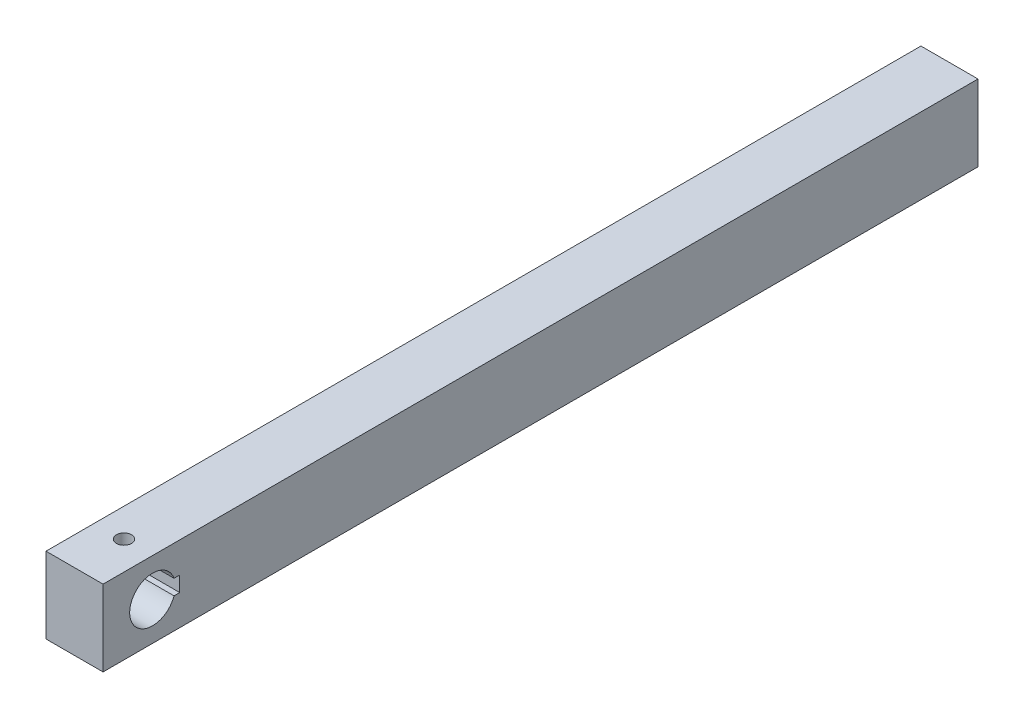
ISO-10303-21;
HEADER;
FILE_DESCRIPTION(('STEP AP214'),'2;1');
FILE_NAME('part.step','',(''),(''),'','','');
FILE_SCHEMA(('AUTOMOTIVE_DESIGN { 1 0 10303 214 1 1 1 1 }'));
ENDSEC;
DATA;
#1=APPLICATION_CONTEXT('core data for automotive mechanical design processes');
#2=APPLICATION_PROTOCOL_DEFINITION('international standard','automotive_design',2000,#1);
#3=PRODUCT_CONTEXT('',#1,'mechanical');
#4=PRODUCT('Part','Part','',(#3));
#5=PRODUCT_RELATED_PRODUCT_CATEGORY('part','',(#4));
#6=PRODUCT_DEFINITION_FORMATION('','',#4);
#7=PRODUCT_DEFINITION_CONTEXT('part definition',#1,'design');
#8=PRODUCT_DEFINITION('design','',#6,#7);
#9=PRODUCT_DEFINITION_SHAPE('','',#8);
#10=(LENGTH_UNIT() NAMED_UNIT(*) SI_UNIT(.MILLI.,.METRE.));
#11=(NAMED_UNIT(*) PLANE_ANGLE_UNIT() SI_UNIT($,.RADIAN.));
#12=(NAMED_UNIT(*) SI_UNIT($,.STERADIAN.) SOLID_ANGLE_UNIT());
#13=UNCERTAINTY_MEASURE_WITH_UNIT(LENGTH_MEASURE(1.E-05),#10,'distance_accuracy_value','');
#14=(GEOMETRIC_REPRESENTATION_CONTEXT(3) GLOBAL_UNCERTAINTY_ASSIGNED_CONTEXT((#13)) GLOBAL_UNIT_ASSIGNED_CONTEXT((#10,
#11,#12)) REPRESENTATION_CONTEXT('',''));
#15=CARTESIAN_POINT('',(0.,0.,0.));
#16=DIRECTION('',(0.,0.,1.));
#17=DIRECTION('',(1.,0.,0.));
#18=AXIS2_PLACEMENT_3D('',#15,#16,#17);
#19=CARTESIAN_POINT('',(7.5,10.,230.));
#20=DIRECTION('',(-1.,0.,0.));
#21=DIRECTION('',(0.,-1.,0.));
#22=AXIS2_PLACEMENT_3D('',#19,#20,#21);
#23=PLANE('',#22);
#24=DIRECTION('',(0.,0.,1.));
#25=VECTOR('',#24,1.);
#26=CARTESIAN_POINT('',(7.5,-2.,230.));
#27=LINE('',#26,#25);
#28=CARTESIAN_POINT('',(7.5,-2.,209.843145750508));
#29=VERTEX_POINT('',#28);
#30=CARTESIAN_POINT('',(7.5,-2.,211.343145750508));
#31=VERTEX_POINT('',#30);
#32=EDGE_CURVE('E139',#29,#31,#27,.T.);
#33=ORIENTED_EDGE('',*,*,#32,.T.);
#34=CARTESIAN_POINT('',(7.5,0.,217.));
#35=DIRECTION('',(-1.,0.,0.));
#36=DIRECTION('',(0.,-1.,0.));
#37=AXIS2_PLACEMENT_3D('',#34,#35,#36);
#38=CIRCLE('',#37,6.00000000000001);
#39=CARTESIAN_POINT('',(7.5,2.,211.343145750508));
#40=VERTEX_POINT('',#39);
#41=EDGE_CURVE('E142',#31,#40,#38,.T.);
#42=ORIENTED_EDGE('',*,*,#41,.T.);
#43=DIRECTION('',(0.,0.,-1.));
#44=VECTOR('',#43,1.);
#45=CARTESIAN_POINT('',(7.5,2.,230.));
#46=LINE('',#45,#44);
#47=CARTESIAN_POINT('',(7.5,2.,209.843145750508));
#48=VERTEX_POINT('',#47);
#49=EDGE_CURVE('E134',#40,#48,#46,.T.);
#50=ORIENTED_EDGE('',*,*,#49,.T.);
#51=DIRECTION('',(0.,-1.,0.));
#52=VECTOR('',#51,1.);
#53=CARTESIAN_POINT('',(7.5,10.,209.843145750508));
#54=LINE('',#53,#52);
#55=EDGE_CURVE('E114',#48,#29,#54,.T.);
#56=ORIENTED_EDGE('',*,*,#55,.T.);
#57=EDGE_LOOP('',(#33,#42,#50,#56));
#58=FACE_BOUND('',#57,.T.);
#59=DIRECTION('',(0.,1.,0.));
#60=VECTOR('',#59,1.);
#61=CARTESIAN_POINT('',(7.5,10.,0.));
#62=LINE('',#61,#60);
#63=CARTESIAN_POINT('',(7.5,-10.,0.));
#64=VERTEX_POINT('',#63);
#65=CARTESIAN_POINT('',(7.5,10.,0.));
#66=VERTEX_POINT('',#65);
#67=EDGE_CURVE('E145',#64,#66,#62,.T.);
#68=ORIENTED_EDGE('',*,*,#67,.T.);
#69=DIRECTION('',(0.,0.,-1.));
#70=VECTOR('',#69,1.);
#71=CARTESIAN_POINT('',(7.5,10.,230.));
#72=LINE('',#71,#70);
#73=CARTESIAN_POINT('',(7.5,10.,230.));
#74=VERTEX_POINT('',#73);
#75=EDGE_CURVE('E11',#74,#66,#72,.T.);
#76=ORIENTED_EDGE('',*,*,#75,.F.);
#77=DIRECTION('',(0.,1.,0.));
#78=VECTOR('',#77,1.);
#79=CARTESIAN_POINT('',(7.5,10.,230.));
#80=LINE('',#79,#78);
#81=CARTESIAN_POINT('',(7.5,-10.,230.));
#82=VERTEX_POINT('',#81);
#83=EDGE_CURVE('E146',#82,#74,#80,.T.);
#84=ORIENTED_EDGE('',*,*,#83,.F.);
#85=DIRECTION('',(0.,0.,-1.));
#86=VECTOR('',#85,1.);
#87=CARTESIAN_POINT('',(7.5,-10.,230.));
#88=LINE('',#87,#86);
#89=EDGE_CURVE('E156',#82,#64,#88,.T.);
#90=ORIENTED_EDGE('',*,*,#89,.T.);
#91=EDGE_LOOP('',(#68,#76,#84,#90));
#92=FACE_BOUND('',#91,.T.);
#93=ADVANCED_FACE('F38',(#58,#92),#23,.F.);
#94=CARTESIAN_POINT('',(-7.5,10.,230.));
#95=DIRECTION('',(0.,-1.,0.));
#96=DIRECTION('',(0.,0.,-1.));
#97=AXIS2_PLACEMENT_3D('',#94,#95,#96);
#98=PLANE('',#97);
#99=CARTESIAN_POINT('',(0.,10.,217.));
#100=DIRECTION('',(0.,1.,0.));
#101=DIRECTION('',(0.,0.,1.));
#102=AXIS2_PLACEMENT_3D('',#99,#100,#101);
#103=CIRCLE('',#102,1.984375);
#104=CARTESIAN_POINT('',(0.,10.,218.984375));
#105=VERTEX_POINT('',#104);
#106=EDGE_CURVE('E224',#105,#105,#103,.T.);
#107=ORIENTED_EDGE('',*,*,#106,.F.);
#108=EDGE_LOOP('',(#107));
#109=FACE_BOUND('',#108,.T.);
#110=DIRECTION('',(-1.,0.,0.));
#111=VECTOR('',#110,1.);
#112=CARTESIAN_POINT('',(-7.5,10.,0.));
#113=LINE('',#112,#111);
#114=CARTESIAN_POINT('',(-7.5,10.,0.));
#115=VERTEX_POINT('',#114);
#116=EDGE_CURVE('E159',#66,#115,#113,.T.);
#117=ORIENTED_EDGE('',*,*,#116,.T.);
#118=DIRECTION('',(0.,0.,-1.));
#119=VECTOR('',#118,1.);
#120=CARTESIAN_POINT('',(-7.5,10.,230.));
#121=LINE('',#120,#119);
#122=CARTESIAN_POINT('',(-7.5,10.,230.));
#123=VERTEX_POINT('',#122);
#124=EDGE_CURVE('E51',#123,#115,#121,.T.);
#125=ORIENTED_EDGE('',*,*,#124,.F.);
#126=DIRECTION('',(-1.,0.,0.));
#127=VECTOR('',#126,1.);
#128=CARTESIAN_POINT('',(-7.5,10.,230.));
#129=LINE('',#128,#127);
#130=EDGE_CURVE('E149',#74,#123,#129,.T.);
#131=ORIENTED_EDGE('',*,*,#130,.F.);
#132=ORIENTED_EDGE('',*,*,#75,.T.);
#133=EDGE_LOOP('',(#117,#125,#131,#132));
#134=FACE_BOUND('',#133,.T.);
#135=ADVANCED_FACE('F188',(#109,#134),#98,.F.);
#136=CARTESIAN_POINT('',(-7.5,10.,230.));
#137=DIRECTION('',(1.,0.,0.));
#138=DIRECTION('',(0.,1.,0.));
#139=AXIS2_PLACEMENT_3D('',#136,#137,#138);
#140=PLANE('',#139);
#141=DIRECTION('',(0.,0.,-1.));
#142=VECTOR('',#141,1.);
#143=CARTESIAN_POINT('',(-7.5,2.,209.843145750508));
#144=LINE('',#143,#142);
#145=CARTESIAN_POINT('',(-7.5,1.99999999999999,211.343145750508));
#146=VERTEX_POINT('',#145);
#147=CARTESIAN_POINT('',(-7.5,2.,209.843145750508));
#148=VERTEX_POINT('',#147);
#149=EDGE_CURVE('E120',#146,#148,#144,.T.);
#150=ORIENTED_EDGE('',*,*,#149,.F.);
#151=CARTESIAN_POINT('',(-7.5,0.,217.));
#152=DIRECTION('',(-1.,0.,0.));
#153=DIRECTION('',(0.,-1.,0.));
#154=AXIS2_PLACEMENT_3D('',#151,#152,#153);
#155=CIRCLE('',#154,6.00000000000001);
#156=CARTESIAN_POINT('',(-7.5,-2.,211.343145750508));
#157=VERTEX_POINT('',#156);
#158=EDGE_CURVE('E66',#157,#146,#155,.T.);
#159=ORIENTED_EDGE('',*,*,#158,.F.);
#160=DIRECTION('',(0.,0.,1.));
#161=VECTOR('',#160,1.);
#162=CARTESIAN_POINT('',(-7.5,-2.,209.843145750508));
#163=LINE('',#162,#161);
#164=CARTESIAN_POINT('',(-7.5,-2.,209.843145750508));
#165=VERTEX_POINT('',#164);
#166=EDGE_CURVE('E127',#165,#157,#163,.T.);
#167=ORIENTED_EDGE('',*,*,#166,.F.);
#168=DIRECTION('',(0.,-1.,0.));
#169=VECTOR('',#168,1.);
#170=CARTESIAN_POINT('',(-7.5,2.,209.843145750508));
#171=LINE('',#170,#169);
#172=EDGE_CURVE('E111',#148,#165,#171,.T.);
#173=ORIENTED_EDGE('',*,*,#172,.F.);
#174=EDGE_LOOP('',(#150,#159,#167,#173));
#175=FACE_BOUND('',#174,.T.);
#176=DIRECTION('',(0.,-1.,0.));
#177=VECTOR('',#176,1.);
#178=CARTESIAN_POINT('',(-7.5,10.,0.));
#179=LINE('',#178,#177);
#180=CARTESIAN_POINT('',(-7.5,-10.,0.));
#181=VERTEX_POINT('',#180);
#182=EDGE_CURVE('E161',#115,#181,#179,.T.);
#183=ORIENTED_EDGE('',*,*,#182,.T.);
#184=DIRECTION('',(0.,0.,-1.));
#185=VECTOR('',#184,1.);
#186=CARTESIAN_POINT('',(-7.5,-10.,230.));
#187=LINE('',#186,#185);
#188=CARTESIAN_POINT('',(-7.5,-10.,230.));
#189=VERTEX_POINT('',#188);
#190=EDGE_CURVE('E166',#189,#181,#187,.T.);
#191=ORIENTED_EDGE('',*,*,#190,.F.);
#192=DIRECTION('',(0.,-1.,0.));
#193=VECTOR('',#192,1.);
#194=CARTESIAN_POINT('',(-7.5,10.,230.));
#195=LINE('',#194,#193);
#196=EDGE_CURVE('E152',#123,#189,#195,.T.);
#197=ORIENTED_EDGE('',*,*,#196,.F.);
#198=ORIENTED_EDGE('',*,*,#124,.T.);
#199=EDGE_LOOP('',(#183,#191,#197,#198));
#200=FACE_BOUND('',#199,.T.);
#201=ADVANCED_FACE('F124',(#175,#200),#140,.F.);
#202=CARTESIAN_POINT('',(-7.5,-10.,230.));
#203=DIRECTION('',(0.,1.,0.));
#204=DIRECTION('',(0.,0.,1.));
#205=AXIS2_PLACEMENT_3D('',#202,#203,#204);
#206=PLANE('',#205);
#207=DIRECTION('',(1.,0.,0.));
#208=VECTOR('',#207,1.);
#209=CARTESIAN_POINT('',(-7.5,-10.,0.));
#210=LINE('',#209,#208);
#211=EDGE_CURVE('E150',#181,#64,#210,.T.);
#212=ORIENTED_EDGE('',*,*,#211,.T.);
#213=ORIENTED_EDGE('',*,*,#89,.F.);
#214=DIRECTION('',(1.,0.,0.));
#215=VECTOR('',#214,1.);
#216=CARTESIAN_POINT('',(-7.5,-10.,230.));
#217=LINE('',#216,#215);
#218=EDGE_CURVE('E154',#189,#82,#217,.T.);
#219=ORIENTED_EDGE('',*,*,#218,.F.);
#220=ORIENTED_EDGE('',*,*,#190,.T.);
#221=EDGE_LOOP('',(#212,#213,#219,#220));
#222=FACE_BOUND('',#221,.T.);
#223=ADVANCED_FACE('F181',(#222),#206,.F.);
#224=CARTESIAN_POINT('',(0.,0.,230.));
#225=DIRECTION('',(0.,0.,1.));
#226=DIRECTION('',(1.,0.,0.));
#227=AXIS2_PLACEMENT_3D('',#224,#225,#226);
#228=PLANE('',#227);
#229=ORIENTED_EDGE('',*,*,#83,.T.);
#230=ORIENTED_EDGE('',*,*,#130,.T.);
#231=ORIENTED_EDGE('',*,*,#196,.T.);
#232=ORIENTED_EDGE('',*,*,#218,.T.);
#233=EDGE_LOOP('',(#229,#230,#231,#232));
#234=FACE_BOUND('',#233,.T.);
#235=ADVANCED_FACE('F187',(#234),#228,.T.);
#236=CARTESIAN_POINT('',(0.,0.,0.));
#237=DIRECTION('',(0.,0.,1.));
#238=DIRECTION('',(1.,0.,0.));
#239=AXIS2_PLACEMENT_3D('',#236,#237,#238);
#240=PLANE('',#239);
#241=ORIENTED_EDGE('',*,*,#67,.F.);
#242=ORIENTED_EDGE('',*,*,#211,.F.);
#243=ORIENTED_EDGE('',*,*,#182,.F.);
#244=ORIENTED_EDGE('',*,*,#116,.F.);
#245=EDGE_LOOP('',(#241,#242,#243,#244));
#246=FACE_BOUND('',#245,.T.);
#247=ADVANCED_FACE('F178',(#246),#240,.F.);
#248=CARTESIAN_POINT('',(37.5,0.,217.));
#249=DIRECTION('',(-1.,0.,0.));
#250=DIRECTION('',(0.,-1.,0.));
#251=AXIS2_PLACEMENT_3D('',#248,#249,#250);
#252=CYLINDRICAL_SURFACE('',#251,6.00000000000001);
#253=CARTESIAN_POINT('',(0.,5.66235426826819,218.984375));
#254=CARTESIAN_POINT('',(0.108138819757154,5.66235406074909,218.984375340178));
#255=CARTESIAN_POINT('',(0.2162759236074,5.66548595879064,218.975505536816));
#256=CARTESIAN_POINT('',(0.429349871968276,5.67761132991367,218.940378002836));
#257=CARTESIAN_POINT('',(0.534286144120666,5.68660584496406,218.914117181281));
#258=CARTESIAN_POINT('',(0.73783780247271,5.70932864073507,218.845228140855));
#259=CARTESIAN_POINT('',(0.836464991957601,5.72304775593342,218.802631594549));
#260=CARTESIAN_POINT('',(1.02520454428127,5.75366069618972,218.70238810627));
#261=CARTESIAN_POINT('',(1.11531506871683,5.77055520434499,218.644737924887));
#262=CARTESIAN_POINT('',(1.28793367286277,5.80634502128158,218.513645498903));
#263=CARTESIAN_POINT('',(1.37006589123694,5.82528962641224,218.439721669057));
#264=CARTESIAN_POINT('',(1.52102305974272,5.86262801346751,218.279208495686));
#265=CARTESIAN_POINT('',(1.58984591014918,5.88102170809265,218.192617157477));
#266=CARTESIAN_POINT('',(1.71393014556128,5.91575568820065,218.006484491273));
#267=CARTESIAN_POINT('',(1.76879857527266,5.93203123304274,217.906668054246));
#268=CARTESIAN_POINT('',(1.86081802137079,5.96011491829826,217.698592027096));
#269=CARTESIAN_POINT('',(1.89797373371851,5.97192424261556,217.590334683675));
#270=CARTESIAN_POINT('',(1.95224094887771,5.98939574657387,217.372390002917));
#271=CARTESIAN_POINT('',(1.96999614323579,5.99525484570673,217.262879021608));
#272=CARTESIAN_POINT('',(1.9870040978909,6.00086429126344,217.04228594645));
#273=CARTESIAN_POINT('',(1.98626155466361,6.00061618827312,216.931204258552));
#274=CARTESIAN_POINT('',(1.9667053354199,5.99417309522021,216.71517582389));
#275=CARTESIAN_POINT('',(1.94859064151666,5.98820813327366,216.610157820136));
#276=CARTESIAN_POINT('',(1.89595908501835,5.97128960028221,216.404746264168));
#277=CARTESIAN_POINT('',(1.86144111536555,5.96033569253524,216.30435302458));
#278=CARTESIAN_POINT('',(1.77656954671366,5.93437510259081,216.109501659826));
#279=CARTESIAN_POINT('',(1.72601536286882,5.91931744549617,216.01513797537));
#280=CARTESIAN_POINT('',(1.61067115844509,5.88671916223221,215.836025217245));
#281=CARTESIAN_POINT('',(1.54587722306716,5.86917785372898,215.751278797292));
#282=CARTESIAN_POINT('',(1.40036192304742,5.83250318488584,215.589647007986));
#283=CARTESIAN_POINT('',(1.31904109263703,5.81333371883096,215.513308738874));
#284=CARTESIAN_POINT('',(1.1445865239989,5.77625145383879,215.37517787862));
#285=CARTESIAN_POINT('',(1.0514510269221,5.75833884262737,215.313387457136));
#286=CARTESIAN_POINT('',(0.854301390389696,5.72560274818391,215.205364704519));
#287=CARTESIAN_POINT('',(0.750154517596288,5.71082545501638,215.159359559298));
#288=CARTESIAN_POINT('',(0.534981232679187,5.68656886602554,215.085723307721));
#289=CARTESIAN_POINT('',(0.423957670680415,5.67708739139546,215.058084644132));
#290=CARTESIAN_POINT('',(0.203474671863518,5.66498780005226,215.023072305643));
#291=CARTESIAN_POINT('',(0.0941654205893162,5.66208308686496,215.014851710008));
#292=CARTESIAN_POINT('',(-0.124286574906565,5.66266550721048,215.016512594918));
#293=CARTESIAN_POINT('',(-0.233429345307848,5.66615150285108,215.026390852886));
#294=CARTESIAN_POINT('',(-0.444624217788682,5.67883719376233,215.063208548664));
#295=CARTESIAN_POINT('',(-0.546791340339591,5.68784077688056,215.089562993711));
#296=CARTESIAN_POINT('',(-0.745233991338486,5.71033244974665,215.157884927162));
#297=CARTESIAN_POINT('',(-0.841508482201312,5.72382132659861,215.199855156063));
#298=CARTESIAN_POINT('',(-1.02877631163421,5.75428739222376,215.299713131448));
#299=CARTESIAN_POINT('',(-1.11950956656044,5.77136065876792,215.358058523989));
#300=CARTESIAN_POINT('',(-1.29020416781434,5.80688375527951,215.488489988435));
#301=CARTESIAN_POINT('',(-1.37016237488548,5.82533398399577,215.560580050072));
#302=CARTESIAN_POINT('',(-1.52094044904549,5.86258656759351,215.720499883314));
#303=CARTESIAN_POINT('',(-1.59115012626138,5.88136437818065,215.808912352684));
#304=CARTESIAN_POINT('',(-1.71577420765693,5.91629521977903,215.996724866792));
#305=CARTESIAN_POINT('',(-1.77018919776685,5.93244834814745,216.096124503754));
#306=CARTESIAN_POINT('',(-1.86117729910003,5.96023200926095,216.302577717403));
#307=CARTESIAN_POINT('',(-1.89786863055066,5.97189240068813,216.40957496076));
#308=CARTESIAN_POINT('',(-1.95258933112295,5.98950592732081,216.628681801514));
#309=CARTESIAN_POINT('',(-1.97062532017833,5.99546108699856,216.740789570662));
#310=CARTESIAN_POINT('',(-1.98693484304646,6.00084273354876,216.961349445732));
#311=CARTESIAN_POINT('',(-1.98608501362997,6.00055883062602,217.069730373503));
#312=CARTESIAN_POINT('',(-1.96680404329573,5.99420483249376,217.284733540686));
#313=CARTESIAN_POINT('',(-1.94837429142684,5.98813519443469,217.39135591837));
#314=CARTESIAN_POINT('',(-1.89503538367356,5.97099608618116,217.598179940123));
#315=CARTESIAN_POINT('',(-1.86038491087094,5.96000521397228,217.698455274244));
#316=CARTESIAN_POINT('',(-1.77582684763807,5.93415551276712,217.891809047115));
#317=CARTESIAN_POINT('',(-1.72591651236168,5.9192959879739,217.984886187323));
#318=CARTESIAN_POINT('',(-1.61015222170593,5.88656588181992,218.16491305565));
#319=CARTESIAN_POINT('',(-1.5437817770598,5.86860503064611,218.251514037399));
#320=CARTESIAN_POINT('',(-1.3978639539214,5.83192072885092,218.412636288621));
#321=CARTESIAN_POINT('',(-1.31831240459482,5.81319703826661,218.487153719738));
#322=CARTESIAN_POINT('',(-1.14464034337271,5.77624429730578,218.624896638069));
#323=CARTESIAN_POINT('',(-1.05007800805058,5.75806177699005,218.687579279931));
#324=CARTESIAN_POINT('',(-0.851197523095288,5.72513778061017,218.796115299383));
#325=CARTESIAN_POINT('',(-0.746882119515978,5.71039534002649,218.841973396257));
#326=CARTESIAN_POINT('',(-0.536809838069813,5.68683495524201,218.913441957922));
#327=CARTESIAN_POINT('',(-0.431390117513214,5.67775603943738,218.939955800914));
#328=CARTESIAN_POINT('',(-0.217312297874126,5.66551677970028,218.975419244231));
#329=CARTESIAN_POINT('',(-0.108655282768994,5.66235447677838,218.984374658197));
#330=CARTESIAN_POINT('',(0.,5.66235426826819,218.984375));
#331=B_SPLINE_CURVE_WITH_KNOTS('',3,(#253,#254,#255,#256,#257,#258,#259,#260,#261,#262,#263,
#264,#265,#266,#267,#268,#269,#270,#271,#272,#273,#274,#275,#276,#277,#278,#279,#280,#281,#282,
#283,#284,#285,#286,#287,#288,#289,#290,#291,#292,#293,#294,#295,#296,#297,#298,#299,#300,#301,
#302,#303,#304,#305,#306,#307,#308,#309,#310,#311,#312,#313,#314,#315,#316,#317,#318,#319,#320,
#321,#322,#323,#324,#325,#326,#327,#328,#329,#330),.UNSPECIFIED.,.T.,.F.,(4,2,2,2,2,2,2,2,2,2,2,
2,2,2,2,2,2,2,2,2,2,2,2,2,2,2,2,2,2,2,2,2,2,2,2,2,2,2,4),(0.,0.324014217710876,
0.648086038507553,0.971532682669744,1.29504898716718,1.62987418000805,1.96475215284293,
2.30821628950215,2.65158931691089,2.98318683813399,3.31470016939574,3.63341105088882,
3.95214344524753,4.27503120795888,4.59800785041481,4.93596838755591,5.27397929604587,
5.6166687894966,5.95921718951534,6.28652487526543,6.61377428818423,6.93001732111535,
7.24631587943402,7.57252756858851,7.89883409336271,8.24055648287037,8.58226619399584,
8.92166403454704,9.26094139685802,9.5845046165173,9.90804227247458,10.2265874001883,
10.5451898594982,10.8754482607952,11.2058113644596,11.5488478718966,11.8917880838811,
12.2174576177691,12.5430193034395),.UNSPECIFIED.);
#332=CARTESIAN_POINT('',(0.,5.66235426826819,218.984375));
#333=VERTEX_POINT('',#332);
#334=EDGE_CURVE('E41',#333,#333,#331,.T.);
#335=ORIENTED_EDGE('',*,*,#334,.T.);
#336=EDGE_LOOP('',(#335));
#337=FACE_BOUND('',#336,.T.);
#338=DIRECTION('',(-1.,0.,0.));
#339=VECTOR('',#338,1.);
#340=CARTESIAN_POINT('',(37.5,-2.,211.343145750508));
#341=LINE('',#340,#339);
#342=EDGE_CURVE('E132',#31,#157,#341,.T.);
#343=ORIENTED_EDGE('',*,*,#342,.T.);
#344=ORIENTED_EDGE('',*,*,#158,.T.);
#345=DIRECTION('',(-1.,0.,0.));
#346=VECTOR('',#345,1.);
#347=CARTESIAN_POINT('',(37.5,2.,211.343145750508));
#348=LINE('',#347,#346);
#349=EDGE_CURVE('E117',#40,#146,#348,.T.);
#350=ORIENTED_EDGE('',*,*,#349,.F.);
#351=ORIENTED_EDGE('',*,*,#41,.F.);
#352=EDGE_LOOP('',(#343,#344,#350,#351));
#353=FACE_BOUND('',#352,.T.);
#354=ADVANCED_FACE('F203',(#337,#353),#252,.F.);
#355=CARTESIAN_POINT('',(37.5,-2.,209.843145750508));
#356=DIRECTION('',(0.,-1.,0.));
#357=DIRECTION('',(1.,0.,0.));
#358=AXIS2_PLACEMENT_3D('',#355,#356,#357);
#359=PLANE('',#358);
#360=DIRECTION('',(-1.,0.,0.));
#361=VECTOR('',#360,1.);
#362=CARTESIAN_POINT('',(37.5,-2.,209.843145750508));
#363=LINE('',#362,#361);
#364=EDGE_CURVE('E116',#29,#165,#363,.T.);
#365=ORIENTED_EDGE('',*,*,#364,.T.);
#366=ORIENTED_EDGE('',*,*,#166,.T.);
#367=ORIENTED_EDGE('',*,*,#342,.F.);
#368=ORIENTED_EDGE('',*,*,#32,.F.);
#369=EDGE_LOOP('',(#365,#366,#367,#368));
#370=FACE_BOUND('',#369,.T.);
#371=ADVANCED_FACE('F208',(#370),#359,.F.);
#372=CARTESIAN_POINT('',(37.5,2.,209.843145750508));
#373=DIRECTION('',(0.,0.,-1.));
#374=DIRECTION('',(-1.,0.,0.));
#375=AXIS2_PLACEMENT_3D('',#372,#373,#374);
#376=PLANE('',#375);
#377=DIRECTION('',(-1.,0.,0.));
#378=VECTOR('',#377,1.);
#379=CARTESIAN_POINT('',(37.5,2.,209.843145750508));
#380=LINE('',#379,#378);
#381=EDGE_CURVE('E58',#48,#148,#380,.T.);
#382=ORIENTED_EDGE('',*,*,#381,.T.);
#383=ORIENTED_EDGE('',*,*,#172,.T.);
#384=ORIENTED_EDGE('',*,*,#364,.F.);
#385=ORIENTED_EDGE('',*,*,#55,.F.);
#386=EDGE_LOOP('',(#382,#383,#384,#385));
#387=FACE_BOUND('',#386,.T.);
#388=ADVANCED_FACE('F108',(#387),#376,.F.);
#389=CARTESIAN_POINT('',(37.5,2.,209.843145750508));
#390=DIRECTION('',(0.,1.,0.));
#391=DIRECTION('',(-1.,0.,0.));
#392=AXIS2_PLACEMENT_3D('',#389,#390,#391);
#393=PLANE('',#392);
#394=ORIENTED_EDGE('',*,*,#349,.T.);
#395=ORIENTED_EDGE('',*,*,#149,.T.);
#396=ORIENTED_EDGE('',*,*,#381,.F.);
#397=ORIENTED_EDGE('',*,*,#49,.F.);
#398=EDGE_LOOP('',(#394,#395,#396,#397));
#399=FACE_BOUND('',#398,.T.);
#400=ADVANCED_FACE('F121',(#399),#393,.F.);
#401=CARTESIAN_POINT('',(0.,0.,217.));
#402=DIRECTION('',(0.,1.,0.));
#403=DIRECTION('',(0.,0.,1.));
#404=AXIS2_PLACEMENT_3D('',#401,#402,#403);
#405=CYLINDRICAL_SURFACE('',#404,1.984375);
#406=ORIENTED_EDGE('',*,*,#106,.T.);
#407=EDGE_LOOP('',(#406));
#408=FACE_BOUND('',#407,.T.);
#409=ORIENTED_EDGE('',*,*,#334,.F.);
#410=EDGE_LOOP('',(#409));
#411=FACE_BOUND('',#410,.T.);
#412=ADVANCED_FACE('F212',(#408,#411),#405,.F.);
#413=CLOSED_SHELL('',(#93,#135,#201,#223,#235,#247,#354,#371,#388,#400,#412));
#414=MANIFOLD_SOLID_BREP('B2',#413);
#415=ADVANCED_BREP_SHAPE_REPRESENTATION('',(#18,#414),#14);
#416=SHAPE_DEFINITION_REPRESENTATION(#9,#415);
ENDSEC;
END-ISO-10303-21;
